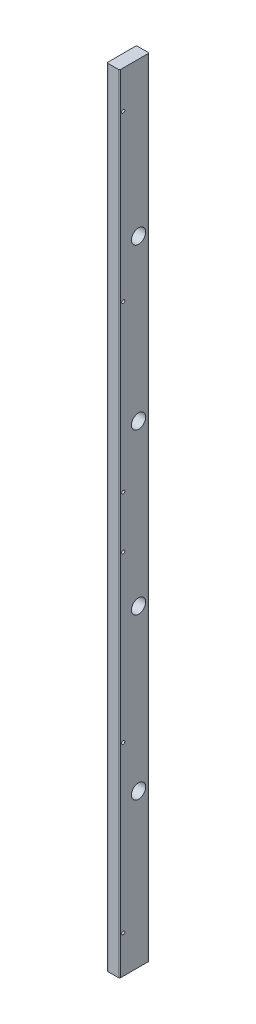
ISO-10303-21;
HEADER;
FILE_DESCRIPTION(('STEP AP214'),'2;1');
FILE_NAME('part.step','',(''),(''),'','','');
FILE_SCHEMA(('AUTOMOTIVE_DESIGN { 1 0 10303 214 1 1 1 1 }'));
ENDSEC;
DATA;
#1=APPLICATION_CONTEXT('core data for automotive mechanical design processes');
#2=APPLICATION_PROTOCOL_DEFINITION('international standard','automotive_design',2000,#1);
#3=PRODUCT_CONTEXT('',#1,'mechanical');
#4=PRODUCT('Part','Part','',(#3));
#5=PRODUCT_RELATED_PRODUCT_CATEGORY('part','',(#4));
#6=PRODUCT_DEFINITION_FORMATION('','',#4);
#7=PRODUCT_DEFINITION_CONTEXT('part definition',#1,'design');
#8=PRODUCT_DEFINITION('design','',#6,#7);
#9=PRODUCT_DEFINITION_SHAPE('','',#8);
#10=(LENGTH_UNIT() NAMED_UNIT(*) SI_UNIT(.MILLI.,.METRE.));
#11=(NAMED_UNIT(*) PLANE_ANGLE_UNIT() SI_UNIT($,.RADIAN.));
#12=(NAMED_UNIT(*) SI_UNIT($,.STERADIAN.) SOLID_ANGLE_UNIT());
#13=UNCERTAINTY_MEASURE_WITH_UNIT(LENGTH_MEASURE(1.E-05),#10,'distance_accuracy_value','');
#14=(GEOMETRIC_REPRESENTATION_CONTEXT(3) GLOBAL_UNCERTAINTY_ASSIGNED_CONTEXT((#13)) GLOBAL_UNIT_ASSIGNED_CONTEXT((#10,
#11,#12)) REPRESENTATION_CONTEXT('',''));
#15=CARTESIAN_POINT('',(0.,0.,0.));
#16=DIRECTION('',(0.,0.,1.));
#17=DIRECTION('',(1.,0.,0.));
#18=AXIS2_PLACEMENT_3D('',#15,#16,#17);
#19=CARTESIAN_POINT('',(19.05,2362.2,44.45));
#20=DIRECTION('',(-1.,0.,0.));
#21=DIRECTION('',(0.,0.,1.));
#22=AXIS2_PLACEMENT_3D('',#19,#20,#21);
#23=PLANE('',#22);
#24=CARTESIAN_POINT('',(19.05,2249.4875,33.3375));
#25=DIRECTION('',(-1.,0.,0.));
#26=DIRECTION('',(0.,0.,-1.));
#27=AXIS2_PLACEMENT_3D('',#24,#25,#26);
#28=CIRCLE('',#27,4.7625);
#29=CARTESIAN_POINT('',(19.05,2249.4875,28.575));
#30=VERTEX_POINT('',#29);
#31=EDGE_CURVE('E224',#30,#30,#28,.T.);
#32=ORIENTED_EDGE('',*,*,#31,.T.);
#33=EDGE_LOOP('',(#32));
#34=FACE_BOUND('',#33,.T.);
#35=CARTESIAN_POINT('',(19.05,1754.1875,33.3375));
#36=DIRECTION('',(-1.,0.,0.));
#37=DIRECTION('',(0.,0.,-1.));
#38=AXIS2_PLACEMENT_3D('',#35,#36,#37);
#39=CIRCLE('',#38,4.76250000000007);
#40=CARTESIAN_POINT('',(19.05,1754.1875,28.5749999999999));
#41=VERTEX_POINT('',#40);
#42=EDGE_CURVE('E218',#41,#41,#39,.T.);
#43=ORIENTED_EDGE('',*,*,#42,.T.);
#44=EDGE_LOOP('',(#43));
#45=FACE_BOUND('',#44,.T.);
#46=CARTESIAN_POINT('',(19.05,1258.8875,33.3375));
#47=DIRECTION('',(-1.,0.,0.));
#48=DIRECTION('',(0.,0.,-1.));
#49=AXIS2_PLACEMENT_3D('',#46,#47,#48);
#50=CIRCLE('',#49,4.76250000000004);
#51=CARTESIAN_POINT('',(19.05,1258.8875,28.575));
#52=VERTEX_POINT('',#51);
#53=EDGE_CURVE('E212',#52,#52,#50,.T.);
#54=ORIENTED_EDGE('',*,*,#53,.T.);
#55=EDGE_LOOP('',(#54));
#56=FACE_BOUND('',#55,.T.);
#57=CARTESIAN_POINT('',(19.05,112.7125,33.3375));
#58=DIRECTION('',(1.,0.,0.));
#59=DIRECTION('',(0.,0.,-1.));
#60=AXIS2_PLACEMENT_3D('',#57,#58,#59);
#61=CIRCLE('',#60,4.7625);
#62=CARTESIAN_POINT('',(19.05,112.7125,28.575));
#63=VERTEX_POINT('',#62);
#64=EDGE_CURVE('E207',#63,#63,#61,.T.);
#65=ORIENTED_EDGE('',*,*,#64,.F.);
#66=EDGE_LOOP('',(#65));
#67=FACE_BOUND('',#66,.T.);
#68=CARTESIAN_POINT('',(19.05,608.0125,33.3375));
#69=DIRECTION('',(1.,0.,0.));
#70=DIRECTION('',(0.,0.,-1.));
#71=AXIS2_PLACEMENT_3D('',#68,#69,#70);
#72=CIRCLE('',#71,4.76250000000007);
#73=CARTESIAN_POINT('',(19.05,608.0125,28.5749999999999));
#74=VERTEX_POINT('',#73);
#75=EDGE_CURVE('E201',#74,#74,#72,.T.);
#76=ORIENTED_EDGE('',*,*,#75,.F.);
#77=EDGE_LOOP('',(#76));
#78=FACE_BOUND('',#77,.T.);
#79=CARTESIAN_POINT('',(19.05,1103.3125,33.3375));
#80=DIRECTION('',(1.,0.,0.));
#81=DIRECTION('',(0.,0.,-1.));
#82=AXIS2_PLACEMENT_3D('',#79,#80,#81);
#83=CIRCLE('',#82,4.76250000000004);
#84=CARTESIAN_POINT('',(19.05,1103.3125,28.575));
#85=VERTEX_POINT('',#84);
#86=EDGE_CURVE('E194',#85,#85,#83,.T.);
#87=ORIENTED_EDGE('',*,*,#86,.F.);
#88=EDGE_LOOP('',(#87));
#89=FACE_BOUND('',#88,.T.);
#90=CARTESIAN_POINT('',(19.05,458.7875,-12.7));
#91=DIRECTION('',(1.,0.,0.));
#92=DIRECTION('',(0.,0.,-1.));
#93=AXIS2_PLACEMENT_3D('',#90,#91,#92);
#94=CIRCLE('',#93,21.43125);
#95=CARTESIAN_POINT('',(19.05,458.7875,-34.13125));
#96=VERTEX_POINT('',#95);
#97=EDGE_CURVE('E137',#96,#96,#94,.T.);
#98=ORIENTED_EDGE('',*,*,#97,.F.);
#99=EDGE_LOOP('',(#98));
#100=FACE_BOUND('',#99,.T.);
#101=CARTESIAN_POINT('',(19.05,939.8,-12.7));
#102=DIRECTION('',(1.,0.,0.));
#103=DIRECTION('',(0.,0.,-1.));
#104=AXIS2_PLACEMENT_3D('',#101,#102,#103);
#105=CIRCLE('',#104,21.43125);
#106=CARTESIAN_POINT('',(19.05,939.8,-34.13125));
#107=VERTEX_POINT('',#106);
#108=EDGE_CURVE('E189',#107,#107,#105,.T.);
#109=ORIENTED_EDGE('',*,*,#108,.F.);
#110=EDGE_LOOP('',(#109));
#111=FACE_BOUND('',#110,.T.);
#112=CARTESIAN_POINT('',(19.05,1420.84425,-12.7));
#113=DIRECTION('',(1.,0.,0.));
#114=DIRECTION('',(0.,0.,-1.));
#115=AXIS2_PLACEMENT_3D('',#112,#113,#114);
#116=CIRCLE('',#115,21.4312499999999);
#117=CARTESIAN_POINT('',(19.05,1420.84425,-34.1312499999999));
#118=VERTEX_POINT('',#117);
#119=EDGE_CURVE('E185',#118,#118,#116,.T.);
#120=ORIENTED_EDGE('',*,*,#119,.F.);
#121=EDGE_LOOP('',(#120));
#122=FACE_BOUND('',#121,.T.);
#123=CARTESIAN_POINT('',(19.05,1901.8885,-12.7));
#124=DIRECTION('',(1.,0.,0.));
#125=DIRECTION('',(0.,0.,-1.));
#126=AXIS2_PLACEMENT_3D('',#123,#124,#125);
#127=CIRCLE('',#126,21.43125);
#128=CARTESIAN_POINT('',(19.05,1901.8885,-34.13125));
#129=VERTEX_POINT('',#128);
#130=EDGE_CURVE('E182',#129,#129,#127,.T.);
#131=ORIENTED_EDGE('',*,*,#130,.F.);
#132=EDGE_LOOP('',(#131));
#133=FACE_BOUND('',#132,.T.);
#134=DIRECTION('',(0.,0.,-1.));
#135=VECTOR('',#134,1.);
#136=CARTESIAN_POINT('',(19.05,0.,44.45));
#137=LINE('',#136,#135);
#138=CARTESIAN_POINT('',(19.05,0.,41.275));
#139=VERTEX_POINT('',#138);
#140=CARTESIAN_POINT('',(19.05,0.,-41.275));
#141=VERTEX_POINT('',#140);
#142=EDGE_CURVE('E129',#139,#141,#137,.T.);
#143=ORIENTED_EDGE('',*,*,#142,.T.);
#144=DIRECTION('',(0.,-1.,0.));
#145=VECTOR('',#144,1.);
#146=CARTESIAN_POINT('',(19.05,2362.2,-41.275));
#147=LINE('',#146,#145);
#148=CARTESIAN_POINT('',(19.05,2362.2,-41.275));
#149=VERTEX_POINT('',#148);
#150=EDGE_CURVE('E11',#141,#149,#147,.F.);
#151=ORIENTED_EDGE('',*,*,#150,.T.);
#152=DIRECTION('',(0.,0.,-1.));
#153=VECTOR('',#152,1.);
#154=CARTESIAN_POINT('',(19.05,2362.2,44.45));
#155=LINE('',#154,#153);
#156=CARTESIAN_POINT('',(19.05,2362.2,41.275));
#157=VERTEX_POINT('',#156);
#158=EDGE_CURVE('E127',#157,#149,#155,.T.);
#159=ORIENTED_EDGE('',*,*,#158,.F.);
#160=DIRECTION('',(0.,-1.,0.));
#161=VECTOR('',#160,1.);
#162=CARTESIAN_POINT('',(19.05,2362.2,41.275));
#163=LINE('',#162,#161);
#164=EDGE_CURVE('E41',#157,#139,#163,.T.);
#165=ORIENTED_EDGE('',*,*,#164,.T.);
#166=EDGE_LOOP('',(#143,#151,#159,#165));
#167=FACE_BOUND('',#166,.T.);
#168=ADVANCED_FACE('F33',(#34,#45,#56,#67,#78,#89,#100,#111,#122,#133,#167),#23,.F.);
#169=CARTESIAN_POINT('',(-19.05,2362.2,-44.45));
#170=DIRECTION('',(0.,0.,1.));
#171=DIRECTION('',(1.,0.,0.));
#172=AXIS2_PLACEMENT_3D('',#169,#170,#171);
#173=PLANE('',#172);
#174=DIRECTION('',(-1.,0.,0.));
#175=VECTOR('',#174,1.);
#176=CARTESIAN_POINT('',(-19.05,0.,-44.45));
#177=LINE('',#176,#175);
#178=CARTESIAN_POINT('',(15.875,0.,-44.45));
#179=VERTEX_POINT('',#178);
#180=CARTESIAN_POINT('',(-15.875,0.,-44.45));
#181=VERTEX_POINT('',#180);
#182=EDGE_CURVE('E125',#179,#181,#177,.T.);
#183=ORIENTED_EDGE('',*,*,#182,.T.);
#184=DIRECTION('',(0.,-1.,0.));
#185=VECTOR('',#184,1.);
#186=CARTESIAN_POINT('',(-15.875,2362.2,-44.45));
#187=LINE('',#186,#185);
#188=CARTESIAN_POINT('',(-15.875,2362.2,-44.45));
#189=VERTEX_POINT('',#188);
#190=EDGE_CURVE('E104',#181,#189,#187,.F.);
#191=ORIENTED_EDGE('',*,*,#190,.T.);
#192=DIRECTION('',(-1.,0.,0.));
#193=VECTOR('',#192,1.);
#194=CARTESIAN_POINT('',(-19.05,2362.2,-44.45));
#195=LINE('',#194,#193);
#196=CARTESIAN_POINT('',(15.875,2362.2,-44.45));
#197=VERTEX_POINT('',#196);
#198=EDGE_CURVE('E178',#197,#189,#195,.T.);
#199=ORIENTED_EDGE('',*,*,#198,.F.);
#200=DIRECTION('',(0.,-1.,0.));
#201=VECTOR('',#200,1.);
#202=CARTESIAN_POINT('',(15.875,2362.2,-44.45));
#203=LINE('',#202,#201);
#204=EDGE_CURVE('E109',#197,#179,#203,.T.);
#205=ORIENTED_EDGE('',*,*,#204,.T.);
#206=EDGE_LOOP('',(#183,#191,#199,#205));
#207=FACE_BOUND('',#206,.T.);
#208=ADVANCED_FACE('F236',(#207),#173,.F.);
#209=CARTESIAN_POINT('',(-19.05,2362.2,44.45));
#210=DIRECTION('',(1.,0.,0.));
#211=DIRECTION('',(0.,0.,-1.));
#212=AXIS2_PLACEMENT_3D('',#209,#210,#211);
#213=PLANE('',#212);
#214=CARTESIAN_POINT('',(-19.05,2249.4875,33.3375));
#215=DIRECTION('',(-1.,0.,0.));
#216=DIRECTION('',(0.,0.,-1.));
#217=AXIS2_PLACEMENT_3D('',#214,#215,#216);
#218=CIRCLE('',#217,4.7625);
#219=CARTESIAN_POINT('',(-19.05,2249.4875,28.575));
#220=VERTEX_POINT('',#219);
#221=EDGE_CURVE('E198',#220,#220,#218,.T.);
#222=ORIENTED_EDGE('',*,*,#221,.F.);
#223=EDGE_LOOP('',(#222));
#224=FACE_BOUND('',#223,.T.);
#225=CARTESIAN_POINT('',(-19.05,1754.1875,33.3375));
#226=DIRECTION('',(-1.,0.,0.));
#227=DIRECTION('',(0.,0.,-1.));
#228=AXIS2_PLACEMENT_3D('',#225,#226,#227);
#229=CIRCLE('',#228,4.76250000000007);
#230=CARTESIAN_POINT('',(-19.05,1754.1875,28.5749999999999));
#231=VERTEX_POINT('',#230);
#232=EDGE_CURVE('E221',#231,#231,#229,.T.);
#233=ORIENTED_EDGE('',*,*,#232,.F.);
#234=EDGE_LOOP('',(#233));
#235=FACE_BOUND('',#234,.T.);
#236=CARTESIAN_POINT('',(-19.05,1258.8875,33.3375));
#237=DIRECTION('',(-1.,0.,0.));
#238=DIRECTION('',(0.,0.,-1.));
#239=AXIS2_PLACEMENT_3D('',#236,#237,#238);
#240=CIRCLE('',#239,4.76250000000004);
#241=CARTESIAN_POINT('',(-19.05,1258.8875,28.575));
#242=VERTEX_POINT('',#241);
#243=EDGE_CURVE('E215',#242,#242,#240,.T.);
#244=ORIENTED_EDGE('',*,*,#243,.F.);
#245=EDGE_LOOP('',(#244));
#246=FACE_BOUND('',#245,.T.);
#247=CARTESIAN_POINT('',(-19.05,112.7125,33.3375));
#248=DIRECTION('',(1.,0.,0.));
#249=DIRECTION('',(0.,0.,-1.));
#250=AXIS2_PLACEMENT_3D('',#247,#248,#249);
#251=CIRCLE('',#250,4.7625);
#252=CARTESIAN_POINT('',(-19.05,112.7125,28.575));
#253=VERTEX_POINT('',#252);
#254=EDGE_CURVE('E186',#253,#253,#251,.T.);
#255=ORIENTED_EDGE('',*,*,#254,.T.);
#256=EDGE_LOOP('',(#255));
#257=FACE_BOUND('',#256,.T.);
#258=CARTESIAN_POINT('',(-19.05,608.0125,33.3375));
#259=DIRECTION('',(1.,0.,0.));
#260=DIRECTION('',(0.,0.,-1.));
#261=AXIS2_PLACEMENT_3D('',#258,#259,#260);
#262=CIRCLE('',#261,4.76250000000007);
#263=CARTESIAN_POINT('',(-19.05,608.0125,28.5749999999999));
#264=VERTEX_POINT('',#263);
#265=EDGE_CURVE('E204',#264,#264,#262,.T.);
#266=ORIENTED_EDGE('',*,*,#265,.T.);
#267=EDGE_LOOP('',(#266));
#268=FACE_BOUND('',#267,.T.);
#269=CARTESIAN_POINT('',(-19.05,1103.3125,33.3375));
#270=DIRECTION('',(1.,0.,0.));
#271=DIRECTION('',(0.,0.,-1.));
#272=AXIS2_PLACEMENT_3D('',#269,#270,#271);
#273=CIRCLE('',#272,4.76250000000004);
#274=CARTESIAN_POINT('',(-19.05,1103.3125,28.575));
#275=VERTEX_POINT('',#274);
#276=EDGE_CURVE('E197',#275,#275,#273,.T.);
#277=ORIENTED_EDGE('',*,*,#276,.T.);
#278=EDGE_LOOP('',(#277));
#279=FACE_BOUND('',#278,.T.);
#280=CARTESIAN_POINT('',(-19.05,458.7875,-12.7));
#281=DIRECTION('',(1.,0.,0.));
#282=DIRECTION('',(0.,0.,-1.));
#283=AXIS2_PLACEMENT_3D('',#280,#281,#282);
#284=CIRCLE('',#283,21.43125);
#285=CARTESIAN_POINT('',(-19.05,458.7875,-34.13125));
#286=VERTEX_POINT('',#285);
#287=EDGE_CURVE('E143',#286,#286,#284,.T.);
#288=ORIENTED_EDGE('',*,*,#287,.T.);
#289=EDGE_LOOP('',(#288));
#290=FACE_BOUND('',#289,.T.);
#291=CARTESIAN_POINT('',(-19.05,939.8,-12.7));
#292=DIRECTION('',(1.,0.,0.));
#293=DIRECTION('',(0.,0.,-1.));
#294=AXIS2_PLACEMENT_3D('',#291,#292,#293);
#295=CIRCLE('',#294,21.43125);
#296=CARTESIAN_POINT('',(-19.05,939.8,-34.13125));
#297=VERTEX_POINT('',#296);
#298=EDGE_CURVE('E140',#297,#297,#295,.T.);
#299=ORIENTED_EDGE('',*,*,#298,.T.);
#300=EDGE_LOOP('',(#299));
#301=FACE_BOUND('',#300,.T.);
#302=CARTESIAN_POINT('',(-19.05,1420.84425,-12.7));
#303=DIRECTION('',(1.,0.,0.));
#304=DIRECTION('',(0.,0.,-1.));
#305=AXIS2_PLACEMENT_3D('',#302,#303,#304);
#306=CIRCLE('',#305,21.4312499999999);
#307=CARTESIAN_POINT('',(-19.05,1420.84425,-34.1312499999999));
#308=VERTEX_POINT('',#307);
#309=EDGE_CURVE('E136',#308,#308,#306,.T.);
#310=ORIENTED_EDGE('',*,*,#309,.T.);
#311=EDGE_LOOP('',(#310));
#312=FACE_BOUND('',#311,.T.);
#313=CARTESIAN_POINT('',(-19.05,1901.8885,-12.7));
#314=DIRECTION('',(1.,0.,0.));
#315=DIRECTION('',(0.,0.,-1.));
#316=AXIS2_PLACEMENT_3D('',#313,#314,#315);
#317=CIRCLE('',#316,21.43125);
#318=CARTESIAN_POINT('',(-19.05,1901.8885,-34.13125));
#319=VERTEX_POINT('',#318);
#320=EDGE_CURVE('E133',#319,#319,#317,.T.);
#321=ORIENTED_EDGE('',*,*,#320,.T.);
#322=EDGE_LOOP('',(#321));
#323=FACE_BOUND('',#322,.T.);
#324=DIRECTION('',(0.,0.,1.));
#325=VECTOR('',#324,1.);
#326=CARTESIAN_POINT('',(-19.05,2362.2,44.45));
#327=LINE('',#326,#325);
#328=CARTESIAN_POINT('',(-19.05,2362.2,-41.275));
#329=VERTEX_POINT('',#328);
#330=CARTESIAN_POINT('',(-19.05,2362.2,41.275));
#331=VERTEX_POINT('',#330);
#332=EDGE_CURVE('E118',#329,#331,#327,.T.);
#333=ORIENTED_EDGE('',*,*,#332,.F.);
#334=DIRECTION('',(0.,-1.,0.));
#335=VECTOR('',#334,1.);
#336=CARTESIAN_POINT('',(-19.05,2362.2,-41.275));
#337=LINE('',#336,#335);
#338=CARTESIAN_POINT('',(-19.05,0.,-41.275));
#339=VERTEX_POINT('',#338);
#340=EDGE_CURVE('E103',#329,#339,#337,.T.);
#341=ORIENTED_EDGE('',*,*,#340,.T.);
#342=DIRECTION('',(0.,0.,1.));
#343=VECTOR('',#342,1.);
#344=CARTESIAN_POINT('',(-19.05,0.,44.45));
#345=LINE('',#344,#343);
#346=CARTESIAN_POINT('',(-19.05,0.,41.275));
#347=VERTEX_POINT('',#346);
#348=EDGE_CURVE('E116',#339,#347,#345,.T.);
#349=ORIENTED_EDGE('',*,*,#348,.T.);
#350=DIRECTION('',(0.,-1.,0.));
#351=VECTOR('',#350,1.);
#352=CARTESIAN_POINT('',(-19.05,2362.2,41.275));
#353=LINE('',#352,#351);
#354=EDGE_CURVE('E120',#347,#331,#353,.F.);
#355=ORIENTED_EDGE('',*,*,#354,.T.);
#356=EDGE_LOOP('',(#333,#341,#349,#355));
#357=FACE_BOUND('',#356,.T.);
#358=ADVANCED_FACE('F115',(#224,#235,#246,#257,#268,#279,#290,#301,#312,#323,#357),#213,.F.);
#359=CARTESIAN_POINT('',(-19.05,2362.2,44.45));
#360=DIRECTION('',(0.,0.,-1.));
#361=DIRECTION('',(-1.,0.,0.));
#362=AXIS2_PLACEMENT_3D('',#359,#360,#361);
#363=PLANE('',#362);
#364=DIRECTION('',(1.,0.,0.));
#365=VECTOR('',#364,1.);
#366=CARTESIAN_POINT('',(-19.05,2362.2,44.45));
#367=LINE('',#366,#365);
#368=CARTESIAN_POINT('',(-15.875,2362.2,44.45));
#369=VERTEX_POINT('',#368);
#370=CARTESIAN_POINT('',(15.875,2362.2,44.45));
#371=VERTEX_POINT('',#370);
#372=EDGE_CURVE('E146',#369,#371,#367,.T.);
#373=ORIENTED_EDGE('',*,*,#372,.F.);
#374=DIRECTION('',(0.,-1.,0.));
#375=VECTOR('',#374,1.);
#376=CARTESIAN_POINT('',(-15.875,2362.2,44.45));
#377=LINE('',#376,#375);
#378=CARTESIAN_POINT('',(-15.875,0.,44.45));
#379=VERTEX_POINT('',#378);
#380=EDGE_CURVE('E163',#369,#379,#377,.T.);
#381=ORIENTED_EDGE('',*,*,#380,.T.);
#382=DIRECTION('',(1.,0.,0.));
#383=VECTOR('',#382,1.);
#384=CARTESIAN_POINT('',(-19.05,0.,44.45));
#385=LINE('',#384,#383);
#386=CARTESIAN_POINT('',(15.875,0.,44.45));
#387=VERTEX_POINT('',#386);
#388=EDGE_CURVE('E124',#379,#387,#385,.T.);
#389=ORIENTED_EDGE('',*,*,#388,.T.);
#390=DIRECTION('',(0.,-1.,0.));
#391=VECTOR('',#390,1.);
#392=CARTESIAN_POINT('',(15.875,2362.2,44.45));
#393=LINE('',#392,#391);
#394=EDGE_CURVE('E48',#387,#371,#393,.F.);
#395=ORIENTED_EDGE('',*,*,#394,.T.);
#396=EDGE_LOOP('',(#373,#381,#389,#395));
#397=FACE_BOUND('',#396,.T.);
#398=ADVANCED_FACE('F235',(#397),#363,.F.);
#399=CARTESIAN_POINT('',(0.,2362.2,0.));
#400=DIRECTION('',(0.,-1.,0.));
#401=DIRECTION('',(0.,0.,-1.));
#402=AXIS2_PLACEMENT_3D('',#399,#400,#401);
#403=PLANE('',#402);
#404=ORIENTED_EDGE('',*,*,#198,.T.);
#405=CARTESIAN_POINT('',(-15.875,2362.2,-41.275));
#406=DIRECTION('',(0.,-1.,0.));
#407=DIRECTION('',(0.,0.,-1.));
#408=AXIS2_PLACEMENT_3D('',#405,#406,#407);
#409=CIRCLE('',#408,3.175);
#410=EDGE_CURVE('E160',#189,#329,#409,.F.);
#411=ORIENTED_EDGE('',*,*,#410,.T.);
#412=ORIENTED_EDGE('',*,*,#332,.T.);
#413=CARTESIAN_POINT('',(-15.875,2362.2,41.275));
#414=DIRECTION('',(0.,-1.,0.));
#415=DIRECTION('',(0.,0.,-1.));
#416=AXIS2_PLACEMENT_3D('',#413,#414,#415);
#417=CIRCLE('',#416,3.175);
#418=EDGE_CURVE('E55',#331,#369,#417,.F.);
#419=ORIENTED_EDGE('',*,*,#418,.T.);
#420=ORIENTED_EDGE('',*,*,#372,.T.);
#421=CARTESIAN_POINT('',(15.875,2362.2,41.275));
#422=DIRECTION('',(0.,-1.,0.));
#423=DIRECTION('',(0.,0.,-1.));
#424=AXIS2_PLACEMENT_3D('',#421,#422,#423);
#425=CIRCLE('',#424,3.175);
#426=EDGE_CURVE('E155',#371,#157,#425,.F.);
#427=ORIENTED_EDGE('',*,*,#426,.T.);
#428=ORIENTED_EDGE('',*,*,#158,.T.);
#429=CARTESIAN_POINT('',(15.875,2362.2,-41.275));
#430=DIRECTION('',(0.,-1.,0.));
#431=DIRECTION('',(0.,0.,-1.));
#432=AXIS2_PLACEMENT_3D('',#429,#430,#431);
#433=CIRCLE('',#432,3.175);
#434=EDGE_CURVE('E157',#149,#197,#433,.F.);
#435=ORIENTED_EDGE('',*,*,#434,.T.);
#436=EDGE_LOOP('',(#404,#411,#412,#419,#420,#427,#428,#435));
#437=FACE_BOUND('',#436,.T.);
#438=ADVANCED_FACE('F268',(#437),#403,.F.);
#439=CARTESIAN_POINT('',(0.,0.,0.));
#440=DIRECTION('',(0.,-1.,0.));
#441=DIRECTION('',(0.,0.,-1.));
#442=AXIS2_PLACEMENT_3D('',#439,#440,#441);
#443=PLANE('',#442);
#444=ORIENTED_EDGE('',*,*,#348,.F.);
#445=CARTESIAN_POINT('',(-15.875,0.,-41.275));
#446=DIRECTION('',(0.,-1.,0.));
#447=DIRECTION('',(0.,0.,-1.));
#448=AXIS2_PLACEMENT_3D('',#445,#446,#447);
#449=CIRCLE('',#448,3.175);
#450=EDGE_CURVE('E99',#339,#181,#449,.T.);
#451=ORIENTED_EDGE('',*,*,#450,.T.);
#452=ORIENTED_EDGE('',*,*,#182,.F.);
#453=CARTESIAN_POINT('',(15.875,0.,-41.275));
#454=DIRECTION('',(0.,-1.,0.));
#455=DIRECTION('',(0.,0.,-1.));
#456=AXIS2_PLACEMENT_3D('',#453,#454,#455);
#457=CIRCLE('',#456,3.175);
#458=EDGE_CURVE('E149',#179,#141,#457,.T.);
#459=ORIENTED_EDGE('',*,*,#458,.T.);
#460=ORIENTED_EDGE('',*,*,#142,.F.);
#461=CARTESIAN_POINT('',(15.875,0.,41.275));
#462=DIRECTION('',(0.,-1.,0.));
#463=DIRECTION('',(0.,0.,-1.));
#464=AXIS2_PLACEMENT_3D('',#461,#462,#463);
#465=CIRCLE('',#464,3.175);
#466=EDGE_CURVE('E119',#139,#387,#465,.T.);
#467=ORIENTED_EDGE('',*,*,#466,.T.);
#468=ORIENTED_EDGE('',*,*,#388,.F.);
#469=CARTESIAN_POINT('',(-15.875,0.,41.275));
#470=DIRECTION('',(0.,-1.,0.));
#471=DIRECTION('',(0.,0.,-1.));
#472=AXIS2_PLACEMENT_3D('',#469,#470,#471);
#473=CIRCLE('',#472,3.175);
#474=EDGE_CURVE('E110',#379,#347,#473,.T.);
#475=ORIENTED_EDGE('',*,*,#474,.T.);
#476=EDGE_LOOP('',(#444,#451,#452,#459,#460,#467,#468,#475));
#477=FACE_BOUND('',#476,.T.);
#478=ADVANCED_FACE('F122',(#477),#443,.T.);
#479=CARTESIAN_POINT('',(-899.6045,1901.8885,-12.7));
#480=DIRECTION('',(1.,0.,0.));
#481=DIRECTION('',(0.,0.,-1.));
#482=AXIS2_PLACEMENT_3D('',#479,#480,#481);
#483=CYLINDRICAL_SURFACE('',#482,21.43125);
#484=ORIENTED_EDGE('',*,*,#130,.T.);
#485=EDGE_LOOP('',(#484));
#486=FACE_BOUND('',#485,.T.);
#487=ORIENTED_EDGE('',*,*,#320,.F.);
#488=EDGE_LOOP('',(#487));
#489=FACE_BOUND('',#488,.T.);
#490=ADVANCED_FACE('F256',(#486,#489),#483,.F.);
#491=CARTESIAN_POINT('',(-899.6045,1420.84425,-12.7));
#492=DIRECTION('',(1.,0.,0.));
#493=DIRECTION('',(0.,0.,-1.));
#494=AXIS2_PLACEMENT_3D('',#491,#492,#493);
#495=CYLINDRICAL_SURFACE('',#494,21.4312499999999);
#496=ORIENTED_EDGE('',*,*,#119,.T.);
#497=EDGE_LOOP('',(#496));
#498=FACE_BOUND('',#497,.T.);
#499=ORIENTED_EDGE('',*,*,#309,.F.);
#500=EDGE_LOOP('',(#499));
#501=FACE_BOUND('',#500,.T.);
#502=ADVANCED_FACE('F258',(#498,#501),#495,.F.);
#503=CARTESIAN_POINT('',(-899.6045,939.8,-12.7));
#504=DIRECTION('',(1.,0.,0.));
#505=DIRECTION('',(0.,0.,-1.));
#506=AXIS2_PLACEMENT_3D('',#503,#504,#505);
#507=CYLINDRICAL_SURFACE('',#506,21.43125);
#508=ORIENTED_EDGE('',*,*,#108,.T.);
#509=EDGE_LOOP('',(#508));
#510=FACE_BOUND('',#509,.T.);
#511=ORIENTED_EDGE('',*,*,#298,.F.);
#512=EDGE_LOOP('',(#511));
#513=FACE_BOUND('',#512,.T.);
#514=ADVANCED_FACE('F265',(#510,#513),#507,.F.);
#515=CARTESIAN_POINT('',(-899.6045,458.7875,-12.7));
#516=DIRECTION('',(1.,0.,0.));
#517=DIRECTION('',(0.,0.,-1.));
#518=AXIS2_PLACEMENT_3D('',#515,#516,#517);
#519=CYLINDRICAL_SURFACE('',#518,21.43125);
#520=ORIENTED_EDGE('',*,*,#97,.T.);
#521=EDGE_LOOP('',(#520));
#522=FACE_BOUND('',#521,.T.);
#523=ORIENTED_EDGE('',*,*,#287,.F.);
#524=EDGE_LOOP('',(#523));
#525=FACE_BOUND('',#524,.T.);
#526=ADVANCED_FACE('F387',(#522,#525),#519,.F.);
#527=CARTESIAN_POINT('',(-19.05,1103.3125,33.3375));
#528=DIRECTION('',(1.,0.,0.));
#529=DIRECTION('',(0.,0.,-1.));
#530=AXIS2_PLACEMENT_3D('',#527,#528,#529);
#531=CYLINDRICAL_SURFACE('',#530,4.76250000000004);
#532=ORIENTED_EDGE('',*,*,#276,.F.);
#533=EDGE_LOOP('',(#532));
#534=FACE_BOUND('',#533,.T.);
#535=ORIENTED_EDGE('',*,*,#86,.T.);
#536=EDGE_LOOP('',(#535));
#537=FACE_BOUND('',#536,.T.);
#538=ADVANCED_FACE('F383',(#534,#537),#531,.F.);
#539=CARTESIAN_POINT('',(-19.05,608.0125,33.3375));
#540=DIRECTION('',(1.,0.,0.));
#541=DIRECTION('',(0.,0.,-1.));
#542=AXIS2_PLACEMENT_3D('',#539,#540,#541);
#543=CYLINDRICAL_SURFACE('',#542,4.76250000000007);
#544=ORIENTED_EDGE('',*,*,#265,.F.);
#545=EDGE_LOOP('',(#544));
#546=FACE_BOUND('',#545,.T.);
#547=ORIENTED_EDGE('',*,*,#75,.T.);
#548=EDGE_LOOP('',(#547));
#549=FACE_BOUND('',#548,.T.);
#550=ADVANCED_FACE('F379',(#546,#549),#543,.F.);
#551=CARTESIAN_POINT('',(-19.05,112.7125,33.3375));
#552=DIRECTION('',(1.,0.,0.));
#553=DIRECTION('',(0.,0.,-1.));
#554=AXIS2_PLACEMENT_3D('',#551,#552,#553);
#555=CYLINDRICAL_SURFACE('',#554,4.7625);
#556=ORIENTED_EDGE('',*,*,#254,.F.);
#557=EDGE_LOOP('',(#556));
#558=FACE_BOUND('',#557,.T.);
#559=ORIENTED_EDGE('',*,*,#64,.T.);
#560=EDGE_LOOP('',(#559));
#561=FACE_BOUND('',#560,.T.);
#562=ADVANCED_FACE('F284',(#558,#561),#555,.F.);
#563=CARTESIAN_POINT('',(-15.875,2362.2,-41.275));
#564=DIRECTION('',(0.,-1.,0.));
#565=DIRECTION('',(0.,0.,-1.));
#566=AXIS2_PLACEMENT_3D('',#563,#564,#565);
#567=CYLINDRICAL_SURFACE('',#566,3.175);
#568=ORIENTED_EDGE('',*,*,#410,.F.);
#569=ORIENTED_EDGE('',*,*,#190,.F.);
#570=ORIENTED_EDGE('',*,*,#450,.F.);
#571=ORIENTED_EDGE('',*,*,#340,.F.);
#572=EDGE_LOOP('',(#568,#569,#570,#571));
#573=FACE_BOUND('',#572,.T.);
#574=ADVANCED_FACE('F102',(#573),#567,.T.);
#575=CARTESIAN_POINT('',(-15.875,2362.2,41.275));
#576=DIRECTION('',(0.,-1.,0.));
#577=DIRECTION('',(0.,0.,-1.));
#578=AXIS2_PLACEMENT_3D('',#575,#576,#577);
#579=CYLINDRICAL_SURFACE('',#578,3.175);
#580=ORIENTED_EDGE('',*,*,#418,.F.);
#581=ORIENTED_EDGE('',*,*,#354,.F.);
#582=ORIENTED_EDGE('',*,*,#474,.F.);
#583=ORIENTED_EDGE('',*,*,#380,.F.);
#584=EDGE_LOOP('',(#580,#581,#582,#583));
#585=FACE_BOUND('',#584,.T.);
#586=ADVANCED_FACE('F283',(#585),#579,.T.);
#587=CARTESIAN_POINT('',(15.875,2362.2,-41.275));
#588=DIRECTION('',(0.,-1.,0.));
#589=DIRECTION('',(0.,0.,-1.));
#590=AXIS2_PLACEMENT_3D('',#587,#588,#589);
#591=CYLINDRICAL_SURFACE('',#590,3.175);
#592=ORIENTED_EDGE('',*,*,#434,.F.);
#593=ORIENTED_EDGE('',*,*,#150,.F.);
#594=ORIENTED_EDGE('',*,*,#458,.F.);
#595=ORIENTED_EDGE('',*,*,#204,.F.);
#596=EDGE_LOOP('',(#592,#593,#594,#595));
#597=FACE_BOUND('',#596,.T.);
#598=ADVANCED_FACE('F286',(#597),#591,.T.);
#599=CARTESIAN_POINT('',(15.875,2362.2,41.275));
#600=DIRECTION('',(0.,-1.,0.));
#601=DIRECTION('',(0.,0.,-1.));
#602=AXIS2_PLACEMENT_3D('',#599,#600,#601);
#603=CYLINDRICAL_SURFACE('',#602,3.175);
#604=ORIENTED_EDGE('',*,*,#426,.F.);
#605=ORIENTED_EDGE('',*,*,#394,.F.);
#606=ORIENTED_EDGE('',*,*,#466,.F.);
#607=ORIENTED_EDGE('',*,*,#164,.F.);
#608=EDGE_LOOP('',(#604,#605,#606,#607));
#609=FACE_BOUND('',#608,.T.);
#610=ADVANCED_FACE('F35',(#609),#603,.T.);
#611=CARTESIAN_POINT('',(-19.05,1258.8875,33.3375));
#612=DIRECTION('',(1.,0.,0.));
#613=DIRECTION('',(0.,0.,-1.));
#614=AXIS2_PLACEMENT_3D('',#611,#612,#613);
#615=CYLINDRICAL_SURFACE('',#614,4.76250000000004);
#616=ORIENTED_EDGE('',*,*,#243,.T.);
#617=EDGE_LOOP('',(#616));
#618=FACE_BOUND('',#617,.T.);
#619=ORIENTED_EDGE('',*,*,#53,.F.);
#620=EDGE_LOOP('',(#619));
#621=FACE_BOUND('',#620,.T.);
#622=ADVANCED_FACE('F293',(#618,#621),#615,.F.);
#623=CARTESIAN_POINT('',(-19.05,1754.1875,33.3375));
#624=DIRECTION('',(1.,0.,0.));
#625=DIRECTION('',(0.,0.,-1.));
#626=AXIS2_PLACEMENT_3D('',#623,#624,#625);
#627=CYLINDRICAL_SURFACE('',#626,4.76250000000007);
#628=ORIENTED_EDGE('',*,*,#232,.T.);
#629=EDGE_LOOP('',(#628));
#630=FACE_BOUND('',#629,.T.);
#631=ORIENTED_EDGE('',*,*,#42,.F.);
#632=EDGE_LOOP('',(#631));
#633=FACE_BOUND('',#632,.T.);
#634=ADVANCED_FACE('F355',(#630,#633),#627,.F.);
#635=CARTESIAN_POINT('',(-19.05,2249.4875,33.3375));
#636=DIRECTION('',(1.,0.,0.));
#637=DIRECTION('',(0.,0.,-1.));
#638=AXIS2_PLACEMENT_3D('',#635,#636,#637);
#639=CYLINDRICAL_SURFACE('',#638,4.7625);
#640=ORIENTED_EDGE('',*,*,#221,.T.);
#641=EDGE_LOOP('',(#640));
#642=FACE_BOUND('',#641,.T.);
#643=ORIENTED_EDGE('',*,*,#31,.F.);
#644=EDGE_LOOP('',(#643));
#645=FACE_BOUND('',#644,.T.);
#646=ADVANCED_FACE('F230',(#642,#645),#639,.F.);
#647=CLOSED_SHELL('',(#168,#208,#358,#398,#438,#478,#490,#502,#514,#526,#538,#550,#562,#574,
#586,#598,#610,#622,#634,#646));
#648=MANIFOLD_SOLID_BREP('B2',#647);
#649=ADVANCED_BREP_SHAPE_REPRESENTATION('',(#18,#648),#14);
#650=SHAPE_DEFINITION_REPRESENTATION(#9,#649);
ENDSEC;
END-ISO-10303-21;
